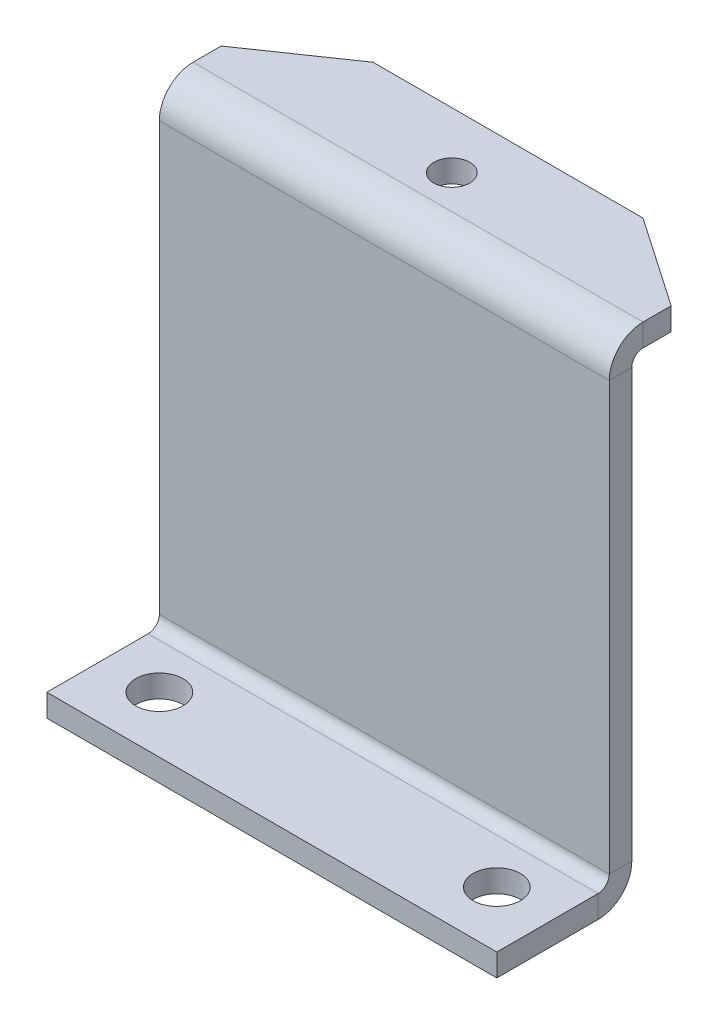
ISO-10303-21;
HEADER;
FILE_DESCRIPTION(('STEP AP214'),'2;1');
FILE_NAME('part.step','',(''),(''),'','','');
FILE_SCHEMA(('AUTOMOTIVE_DESIGN { 1 0 10303 214 1 1 1 1 }'));
ENDSEC;
DATA;
#1=APPLICATION_CONTEXT('core data for automotive mechanical design processes');
#2=APPLICATION_PROTOCOL_DEFINITION('international standard','automotive_design',2000,#1);
#3=PRODUCT_CONTEXT('',#1,'mechanical');
#4=PRODUCT('Part','Part','',(#3));
#5=PRODUCT_RELATED_PRODUCT_CATEGORY('part','',(#4));
#6=PRODUCT_DEFINITION_FORMATION('','',#4);
#7=PRODUCT_DEFINITION_CONTEXT('part definition',#1,'design');
#8=PRODUCT_DEFINITION('design','',#6,#7);
#9=PRODUCT_DEFINITION_SHAPE('','',#8);
#10=(LENGTH_UNIT() NAMED_UNIT(*) SI_UNIT(.MILLI.,.METRE.));
#11=(NAMED_UNIT(*) PLANE_ANGLE_UNIT() SI_UNIT($,.RADIAN.));
#12=(NAMED_UNIT(*) SI_UNIT($,.STERADIAN.) SOLID_ANGLE_UNIT());
#13=UNCERTAINTY_MEASURE_WITH_UNIT(LENGTH_MEASURE(1.E-05),#10,'distance_accuracy_value','');
#14=(GEOMETRIC_REPRESENTATION_CONTEXT(3) GLOBAL_UNCERTAINTY_ASSIGNED_CONTEXT((#13)) GLOBAL_UNIT_ASSIGNED_CONTEXT((#10,
#11,#12)) REPRESENTATION_CONTEXT('',''));
#15=CARTESIAN_POINT('',(0.,0.,0.));
#16=DIRECTION('',(0.,0.,1.));
#17=DIRECTION('',(1.,0.,0.));
#18=AXIS2_PLACEMENT_3D('',#15,#16,#17);
#19=CARTESIAN_POINT('',(20.,0.,-5.));
#20=DIRECTION('',(-1.,0.,0.));
#21=DIRECTION('',(0.,-1.,0.));
#22=AXIS2_PLACEMENT_3D('',#19,#20,#21);
#23=PLANE('',#22);
#24=DIRECTION('',(0.,0.,1.));
#25=VECTOR('',#24,1.);
#26=CARTESIAN_POINT('',(20.,3.,-5.));
#27=LINE('',#26,#25);
#28=CARTESIAN_POINT('',(20.,3.,-7.));
#29=VERTEX_POINT('',#28);
#30=CARTESIAN_POINT('',(20.,3.,-5.));
#31=VERTEX_POINT('',#30);
#32=EDGE_CURVE('E11',#29,#31,#27,.T.);
#33=ORIENTED_EDGE('',*,*,#32,.F.);
#34=DIRECTION('',(0.,1.,0.));
#35=VECTOR('',#34,1.);
#36=CARTESIAN_POINT('',(20.,0.,-7.));
#37=LINE('',#36,#35);
#38=CARTESIAN_POINT('',(20.,41.,-7.));
#39=VERTEX_POINT('',#38);
#40=EDGE_CURVE('E104',#39,#29,#37,.F.);
#41=ORIENTED_EDGE('',*,*,#40,.F.);
#42=DIRECTION('',(0.,0.,1.));
#43=VECTOR('',#42,1.);
#44=CARTESIAN_POINT('',(20.,41.,-5.));
#45=LINE('',#44,#43);
#46=CARTESIAN_POINT('',(20.,41.,-5.));
#47=VERTEX_POINT('',#46);
#48=EDGE_CURVE('E51',#39,#47,#45,.T.);
#49=ORIENTED_EDGE('',*,*,#48,.T.);
#50=DIRECTION('',(0.,-1.,0.));
#51=VECTOR('',#50,1.);
#52=CARTESIAN_POINT('',(20.,0.,-5.));
#53=LINE('',#52,#51);
#54=EDGE_CURVE('E106',#47,#31,#53,.T.);
#55=ORIENTED_EDGE('',*,*,#54,.T.);
#56=EDGE_LOOP('',(#33,#41,#49,#55));
#57=FACE_BOUND('',#56,.T.);
#58=ADVANCED_FACE('F41',(#57),#23,.F.);
#59=CARTESIAN_POINT('',(20.,41.,-8.));
#60=DIRECTION('',(-1.,0.,0.));
#61=DIRECTION('',(0.,0.,1.));
#62=AXIS2_PLACEMENT_3D('',#59,#60,#61);
#63=PLANE('',#62);
#64=ORIENTED_EDGE('',*,*,#48,.F.);
#65=CARTESIAN_POINT('',(20.,41.,-8.));
#66=DIRECTION('',(-1.,0.,0.));
#67=DIRECTION('',(0.,0.,1.));
#68=AXIS2_PLACEMENT_3D('',#65,#66,#67);
#69=CIRCLE('',#68,1.);
#70=CARTESIAN_POINT('',(20.,42.,-8.));
#71=VERTEX_POINT('',#70);
#72=EDGE_CURVE('E196',#39,#71,#69,.T.);
#73=ORIENTED_EDGE('',*,*,#72,.T.);
#74=DIRECTION('',(0.,1.,0.));
#75=VECTOR('',#74,1.);
#76=CARTESIAN_POINT('',(20.,44.,-8.));
#77=LINE('',#76,#75);
#78=CARTESIAN_POINT('',(20.,44.,-8.));
#79=VERTEX_POINT('',#78);
#80=EDGE_CURVE('E186',#71,#79,#77,.T.);
#81=ORIENTED_EDGE('',*,*,#80,.T.);
#82=CARTESIAN_POINT('',(20.,41.,-8.));
#83=DIRECTION('',(1.,0.,0.));
#84=DIRECTION('',(0.,0.,-1.));
#85=AXIS2_PLACEMENT_3D('',#82,#83,#84);
#86=CIRCLE('',#85,3.);
#87=EDGE_CURVE('E194',#47,#79,#86,.F.);
#88=ORIENTED_EDGE('',*,*,#87,.F.);
#89=EDGE_LOOP('',(#64,#73,#81,#88));
#90=FACE_BOUND('',#89,.T.);
#91=ADVANCED_FACE('F193',(#90),#63,.F.);
#92=CARTESIAN_POINT('',(20.,44.,-7.));
#93=DIRECTION('',(1.,0.,0.));
#94=DIRECTION('',(0.,0.,1.));
#95=AXIS2_PLACEMENT_3D('',#92,#93,#94);
#96=PLANE('',#95);
#97=ORIENTED_EDGE('',*,*,#80,.F.);
#98=DIRECTION('',(0.,0.,-1.));
#99=VECTOR('',#98,1.);
#100=CARTESIAN_POINT('',(20.,42.,-7.));
#101=LINE('',#100,#99);
#102=CARTESIAN_POINT('',(20.,42.,-10.5));
#103=VERTEX_POINT('',#102);
#104=EDGE_CURVE('E258',#103,#71,#101,.F.);
#105=ORIENTED_EDGE('',*,*,#104,.F.);
#106=DIRECTION('',(0.,1.,0.));
#107=VECTOR('',#106,1.);
#108=CARTESIAN_POINT('',(20.,44.,-10.5));
#109=LINE('',#108,#107);
#110=CARTESIAN_POINT('',(20.,44.,-10.5));
#111=VERTEX_POINT('',#110);
#112=EDGE_CURVE('E183',#103,#111,#109,.T.);
#113=ORIENTED_EDGE('',*,*,#112,.T.);
#114=DIRECTION('',(0.,0.,1.));
#115=VECTOR('',#114,1.);
#116=CARTESIAN_POINT('',(20.,44.,-7.));
#117=LINE('',#116,#115);
#118=EDGE_CURVE('E213',#111,#79,#117,.T.);
#119=ORIENTED_EDGE('',*,*,#118,.T.);
#120=EDGE_LOOP('',(#97,#105,#113,#119));
#121=FACE_BOUND('',#120,.T.);
#122=ADVANCED_FACE('F214',(#121),#96,.T.);
#123=CARTESIAN_POINT('',(20.,44.,-10.5));
#124=DIRECTION('',(0.566528822887065,0.,-0.824041924199368));
#125=DIRECTION('',(0.824041924199368,0.,0.566528822887065));
#126=AXIS2_PLACEMENT_3D('',#123,#124,#125);
#127=PLANE('',#126);
#128=ORIENTED_EDGE('',*,*,#112,.F.);
#129=DIRECTION('',(0.824041924199368,0.,0.566528822887065));
#130=VECTOR('',#129,1.);
#131=CARTESIAN_POINT('',(20.,42.,-10.5));
#132=LINE('',#131,#130);
#133=CARTESIAN_POINT('',(12.,42.,-16.));
#134=VERTEX_POINT('',#133);
#135=EDGE_CURVE('E156',#134,#103,#132,.T.);
#136=ORIENTED_EDGE('',*,*,#135,.F.);
#137=DIRECTION('',(0.,1.,0.));
#138=VECTOR('',#137,1.);
#139=CARTESIAN_POINT('',(12.,44.,-16.));
#140=LINE('',#139,#138);
#141=CARTESIAN_POINT('',(12.,44.,-16.));
#142=VERTEX_POINT('',#141);
#143=EDGE_CURVE('E180',#134,#142,#140,.T.);
#144=ORIENTED_EDGE('',*,*,#143,.T.);
#145=DIRECTION('',(0.824041924199368,0.,0.566528822887065));
#146=VECTOR('',#145,1.);
#147=CARTESIAN_POINT('',(20.,44.,-10.5));
#148=LINE('',#147,#146);
#149=EDGE_CURVE('E219',#142,#111,#148,.T.);
#150=ORIENTED_EDGE('',*,*,#149,.T.);
#151=EDGE_LOOP('',(#128,#136,#144,#150));
#152=FACE_BOUND('',#151,.T.);
#153=ADVANCED_FACE('F273',(#152),#127,.T.);
#154=CARTESIAN_POINT('',(-20.,44.,-16.));
#155=DIRECTION('',(0.,0.,1.));
#156=DIRECTION('',(-1.,0.,0.));
#157=AXIS2_PLACEMENT_3D('',#154,#155,#156);
#158=PLANE('',#157);
#159=ORIENTED_EDGE('',*,*,#143,.F.);
#160=DIRECTION('',(1.,0.,0.));
#161=VECTOR('',#160,1.);
#162=CARTESIAN_POINT('',(20.,42.,-16.));
#163=LINE('',#162,#161);
#164=CARTESIAN_POINT('',(-12.,42.,-16.));
#165=VERTEX_POINT('',#164);
#166=EDGE_CURVE('E141',#134,#165,#163,.F.);
#167=ORIENTED_EDGE('',*,*,#166,.T.);
#168=DIRECTION('',(0.,1.,0.));
#169=VECTOR('',#168,1.);
#170=CARTESIAN_POINT('',(-12.,44.,-16.));
#171=LINE('',#170,#169);
#172=CARTESIAN_POINT('',(-12.,44.,-16.));
#173=VERTEX_POINT('',#172);
#174=EDGE_CURVE('E177',#165,#173,#171,.T.);
#175=ORIENTED_EDGE('',*,*,#174,.T.);
#176=DIRECTION('',(-1.,0.,0.));
#177=VECTOR('',#176,1.);
#178=CARTESIAN_POINT('',(-20.,44.,-16.));
#179=LINE('',#178,#177);
#180=EDGE_CURVE('E312',#142,#173,#179,.T.);
#181=ORIENTED_EDGE('',*,*,#180,.F.);
#182=EDGE_LOOP('',(#159,#167,#175,#181));
#183=FACE_BOUND('',#182,.T.);
#184=ADVANCED_FACE('F583',(#183),#158,.F.);
#185=CARTESIAN_POINT('',(-20.,44.,-10.5));
#186=DIRECTION('',(-0.566528822887065,0.,-0.824041924199368));
#187=DIRECTION('',(0.824041924199368,0.,-0.566528822887065));
#188=AXIS2_PLACEMENT_3D('',#185,#186,#187);
#189=PLANE('',#188);
#190=ORIENTED_EDGE('',*,*,#174,.F.);
#191=DIRECTION('',(0.824041924199368,0.,-0.566528822887065));
#192=VECTOR('',#191,1.);
#193=CARTESIAN_POINT('',(-20.,42.,-10.5));
#194=LINE('',#193,#192);
#195=CARTESIAN_POINT('',(-20.,42.,-10.5));
#196=VERTEX_POINT('',#195);
#197=EDGE_CURVE('E144',#196,#165,#194,.T.);
#198=ORIENTED_EDGE('',*,*,#197,.F.);
#199=DIRECTION('',(0.,1.,0.));
#200=VECTOR('',#199,1.);
#201=CARTESIAN_POINT('',(-20.,44.,-10.5));
#202=LINE('',#201,#200);
#203=CARTESIAN_POINT('',(-20.,44.,-10.5));
#204=VERTEX_POINT('',#203);
#205=EDGE_CURVE('E174',#196,#204,#202,.T.);
#206=ORIENTED_EDGE('',*,*,#205,.T.);
#207=DIRECTION('',(0.824041924199368,0.,-0.566528822887065));
#208=VECTOR('',#207,1.);
#209=CARTESIAN_POINT('',(-20.,44.,-10.5));
#210=LINE('',#209,#208);
#211=EDGE_CURVE('E313',#204,#173,#210,.T.);
#212=ORIENTED_EDGE('',*,*,#211,.T.);
#213=EDGE_LOOP('',(#190,#198,#206,#212));
#214=FACE_BOUND('',#213,.T.);
#215=ADVANCED_FACE('F318',(#214),#189,.T.);
#216=CARTESIAN_POINT('',(-20.,44.,-7.));
#217=DIRECTION('',(1.,0.,0.));
#218=DIRECTION('',(0.,0.,1.));
#219=AXIS2_PLACEMENT_3D('',#216,#217,#218);
#220=PLANE('',#219);
#221=ORIENTED_EDGE('',*,*,#205,.F.);
#222=DIRECTION('',(0.,0.,-1.));
#223=VECTOR('',#222,1.);
#224=CARTESIAN_POINT('',(-20.,42.,-7.));
#225=LINE('',#224,#223);
#226=CARTESIAN_POINT('',(-20.,42.,-8.));
#227=VERTEX_POINT('',#226);
#228=EDGE_CURVE('E255',#196,#227,#225,.F.);
#229=ORIENTED_EDGE('',*,*,#228,.T.);
#230=DIRECTION('',(0.,1.,0.));
#231=VECTOR('',#230,1.);
#232=CARTESIAN_POINT('',(-20.,44.,-8.));
#233=LINE('',#232,#231);
#234=CARTESIAN_POINT('',(-20.,44.,-8.));
#235=VERTEX_POINT('',#234);
#236=EDGE_CURVE('E171',#227,#235,#233,.T.);
#237=ORIENTED_EDGE('',*,*,#236,.T.);
#238=DIRECTION('',(0.,0.,1.));
#239=VECTOR('',#238,1.);
#240=CARTESIAN_POINT('',(-20.,44.,-7.));
#241=LINE('',#240,#239);
#242=EDGE_CURVE('E220',#204,#235,#241,.T.);
#243=ORIENTED_EDGE('',*,*,#242,.F.);
#244=EDGE_LOOP('',(#221,#229,#237,#243));
#245=FACE_BOUND('',#244,.T.);
#246=ADVANCED_FACE('F323',(#245),#220,.F.);
#247=CARTESIAN_POINT('',(-20.,41.,-8.));
#248=DIRECTION('',(-1.,0.,0.));
#249=DIRECTION('',(0.,0.,1.));
#250=AXIS2_PLACEMENT_3D('',#247,#248,#249);
#251=PLANE('',#250);
#252=ORIENTED_EDGE('',*,*,#236,.F.);
#253=CARTESIAN_POINT('',(-20.,41.,-8.));
#254=DIRECTION('',(-1.,0.,0.));
#255=DIRECTION('',(0.,0.,1.));
#256=AXIS2_PLACEMENT_3D('',#253,#254,#255);
#257=CIRCLE('',#256,1.);
#258=CARTESIAN_POINT('',(-20.,41.,-7.));
#259=VERTEX_POINT('',#258);
#260=EDGE_CURVE('E146',#227,#259,#257,.F.);
#261=ORIENTED_EDGE('',*,*,#260,.T.);
#262=DIRECTION('',(0.,0.,1.));
#263=VECTOR('',#262,1.);
#264=CARTESIAN_POINT('',(-20.,41.,-5.));
#265=LINE('',#264,#263);
#266=CARTESIAN_POINT('',(-20.,41.,-5.));
#267=VERTEX_POINT('',#266);
#268=EDGE_CURVE('E169',#259,#267,#265,.T.);
#269=ORIENTED_EDGE('',*,*,#268,.T.);
#270=CARTESIAN_POINT('',(-20.,41.,-8.));
#271=DIRECTION('',(1.,0.,0.));
#272=DIRECTION('',(0.,0.,-1.));
#273=AXIS2_PLACEMENT_3D('',#270,#271,#272);
#274=CIRCLE('',#273,3.);
#275=EDGE_CURVE('E210',#235,#267,#274,.T.);
#276=ORIENTED_EDGE('',*,*,#275,.F.);
#277=EDGE_LOOP('',(#252,#261,#269,#276));
#278=FACE_BOUND('',#277,.T.);
#279=ADVANCED_FACE('F327',(#278),#251,.T.);
#280=CARTESIAN_POINT('',(-20.,0.,-5.));
#281=DIRECTION('',(1.,0.,0.));
#282=DIRECTION('',(0.,1.,0.));
#283=AXIS2_PLACEMENT_3D('',#280,#281,#282);
#284=PLANE('',#283);
#285=ORIENTED_EDGE('',*,*,#268,.F.);
#286=DIRECTION('',(0.,1.,0.));
#287=VECTOR('',#286,1.);
#288=CARTESIAN_POINT('',(-20.,0.,-7.));
#289=LINE('',#288,#287);
#290=CARTESIAN_POINT('',(-20.,3.,-7.));
#291=VERTEX_POINT('',#290);
#292=EDGE_CURVE('E134',#291,#259,#289,.T.);
#293=ORIENTED_EDGE('',*,*,#292,.F.);
#294=DIRECTION('',(0.,0.,1.));
#295=VECTOR('',#294,1.);
#296=CARTESIAN_POINT('',(-20.,3.,-5.));
#297=LINE('',#296,#295);
#298=CARTESIAN_POINT('',(-20.,3.,-5.));
#299=VERTEX_POINT('',#298);
#300=EDGE_CURVE('E166',#291,#299,#297,.T.);
#301=ORIENTED_EDGE('',*,*,#300,.T.);
#302=DIRECTION('',(0.,1.,0.));
#303=VECTOR('',#302,1.);
#304=CARTESIAN_POINT('',(-20.,0.,-5.));
#305=LINE('',#304,#303);
#306=EDGE_CURVE('E286',#299,#267,#305,.T.);
#307=ORIENTED_EDGE('',*,*,#306,.T.);
#308=EDGE_LOOP('',(#285,#293,#301,#307));
#309=FACE_BOUND('',#308,.T.);
#310=ADVANCED_FACE('F330',(#309),#284,.F.);
#311=CARTESIAN_POINT('',(-20.,3.,-4.));
#312=DIRECTION('',(1.,0.,0.));
#313=DIRECTION('',(0.,0.,-1.));
#314=AXIS2_PLACEMENT_3D('',#311,#312,#313);
#315=PLANE('',#314);
#316=ORIENTED_EDGE('',*,*,#300,.F.);
#317=CARTESIAN_POINT('',(-20.,3.,-4.));
#318=DIRECTION('',(1.,0.,0.));
#319=DIRECTION('',(0.,0.,-1.));
#320=AXIS2_PLACEMENT_3D('',#317,#318,#319);
#321=CIRCLE('',#320,3.);
#322=CARTESIAN_POINT('',(-20.,0.,-4.));
#323=VERTEX_POINT('',#322);
#324=EDGE_CURVE('E122',#291,#323,#321,.F.);
#325=ORIENTED_EDGE('',*,*,#324,.T.);
#326=DIRECTION('',(0.,1.,0.));
#327=VECTOR('',#326,1.);
#328=CARTESIAN_POINT('',(-20.,2.,-4.));
#329=LINE('',#328,#327);
#330=CARTESIAN_POINT('',(-20.,2.,-4.));
#331=VERTEX_POINT('',#330);
#332=EDGE_CURVE('E163',#323,#331,#329,.T.);
#333=ORIENTED_EDGE('',*,*,#332,.T.);
#334=CARTESIAN_POINT('',(-20.,3.,-4.));
#335=DIRECTION('',(-1.,0.,0.));
#336=DIRECTION('',(0.,0.,1.));
#337=AXIS2_PLACEMENT_3D('',#334,#335,#336);
#338=CIRCLE('',#337,1.);
#339=EDGE_CURVE('E238',#299,#331,#338,.T.);
#340=ORIENTED_EDGE('',*,*,#339,.F.);
#341=EDGE_LOOP('',(#316,#325,#333,#340));
#342=FACE_BOUND('',#341,.T.);
#343=ADVANCED_FACE('F362',(#342),#315,.F.);
#344=CARTESIAN_POINT('',(-20.,2.,-5.));
#345=DIRECTION('',(-1.,0.,0.));
#346=DIRECTION('',(0.,0.,1.));
#347=AXIS2_PLACEMENT_3D('',#344,#345,#346);
#348=PLANE('',#347);
#349=ORIENTED_EDGE('',*,*,#332,.F.);
#350=DIRECTION('',(0.,0.,1.));
#351=VECTOR('',#350,1.);
#352=CARTESIAN_POINT('',(-20.,0.,0.));
#353=LINE('',#352,#351);
#354=CARTESIAN_POINT('',(-20.,0.,5.));
#355=VERTEX_POINT('',#354);
#356=EDGE_CURVE('E247',#323,#355,#353,.T.);
#357=ORIENTED_EDGE('',*,*,#356,.T.);
#358=DIRECTION('',(0.,1.,0.));
#359=VECTOR('',#358,1.);
#360=CARTESIAN_POINT('',(-20.,2.,5.));
#361=LINE('',#360,#359);
#362=CARTESIAN_POINT('',(-20.,2.,5.));
#363=VERTEX_POINT('',#362);
#364=EDGE_CURVE('E160',#355,#363,#361,.T.);
#365=ORIENTED_EDGE('',*,*,#364,.T.);
#366=DIRECTION('',(0.,0.,1.));
#367=VECTOR('',#366,1.);
#368=CARTESIAN_POINT('',(-20.,2.,-5.));
#369=LINE('',#368,#367);
#370=EDGE_CURVE('E295',#331,#363,#369,.T.);
#371=ORIENTED_EDGE('',*,*,#370,.F.);
#372=EDGE_LOOP('',(#349,#357,#365,#371));
#373=FACE_BOUND('',#372,.T.);
#374=ADVANCED_FACE('F345',(#373),#348,.T.);
#375=CARTESIAN_POINT('',(-20.,2.,5.));
#376=DIRECTION('',(0.,0.,1.));
#377=DIRECTION('',(1.,0.,0.));
#378=AXIS2_PLACEMENT_3D('',#375,#376,#377);
#379=PLANE('',#378);
#380=ORIENTED_EDGE('',*,*,#364,.F.);
#381=DIRECTION('',(1.,0.,0.));
#382=VECTOR('',#381,1.);
#383=CARTESIAN_POINT('',(0.,0.,5.));
#384=LINE('',#383,#382);
#385=CARTESIAN_POINT('',(20.,0.,5.));
#386=VERTEX_POINT('',#385);
#387=EDGE_CURVE('E153',#355,#386,#384,.T.);
#388=ORIENTED_EDGE('',*,*,#387,.T.);
#389=DIRECTION('',(0.,1.,0.));
#390=VECTOR('',#389,1.);
#391=CARTESIAN_POINT('',(20.,2.,5.));
#392=LINE('',#391,#390);
#393=CARTESIAN_POINT('',(20.,2.,5.));
#394=VERTEX_POINT('',#393);
#395=EDGE_CURVE('E157',#386,#394,#392,.T.);
#396=ORIENTED_EDGE('',*,*,#395,.T.);
#397=DIRECTION('',(1.,0.,0.));
#398=VECTOR('',#397,1.);
#399=CARTESIAN_POINT('',(-20.,2.,5.));
#400=LINE('',#399,#398);
#401=EDGE_CURVE('E298',#363,#394,#400,.T.);
#402=ORIENTED_EDGE('',*,*,#401,.F.);
#403=EDGE_LOOP('',(#380,#388,#396,#402));
#404=FACE_BOUND('',#403,.T.);
#405=ADVANCED_FACE('F353',(#404),#379,.T.);
#406=CARTESIAN_POINT('',(20.,2.,-5.));
#407=DIRECTION('',(1.,0.,0.));
#408=DIRECTION('',(0.,0.,-1.));
#409=AXIS2_PLACEMENT_3D('',#406,#407,#408);
#410=PLANE('',#409);
#411=ORIENTED_EDGE('',*,*,#395,.F.);
#412=DIRECTION('',(0.,0.,1.));
#413=VECTOR('',#412,1.);
#414=CARTESIAN_POINT('',(20.,0.,0.));
#415=LINE('',#414,#413);
#416=CARTESIAN_POINT('',(20.,0.,-4.));
#417=VERTEX_POINT('',#416);
#418=EDGE_CURVE('E245',#386,#417,#415,.F.);
#419=ORIENTED_EDGE('',*,*,#418,.T.);
#420=DIRECTION('',(0.,1.,0.));
#421=VECTOR('',#420,1.);
#422=CARTESIAN_POINT('',(20.,2.,-4.));
#423=LINE('',#422,#421);
#424=CARTESIAN_POINT('',(20.,2.,-4.));
#425=VERTEX_POINT('',#424);
#426=EDGE_CURVE('E45',#417,#425,#423,.T.);
#427=ORIENTED_EDGE('',*,*,#426,.T.);
#428=DIRECTION('',(0.,0.,-1.));
#429=VECTOR('',#428,1.);
#430=CARTESIAN_POINT('',(20.,2.,-5.));
#431=LINE('',#430,#429);
#432=EDGE_CURVE('E292',#394,#425,#431,.T.);
#433=ORIENTED_EDGE('',*,*,#432,.F.);
#434=EDGE_LOOP('',(#411,#419,#427,#433));
#435=FACE_BOUND('',#434,.T.);
#436=ADVANCED_FACE('F357',(#435),#410,.T.);
#437=CARTESIAN_POINT('',(0.,44.,-11.));
#438=DIRECTION('',(0.,-1.,0.));
#439=DIRECTION('',(0.,0.,-1.));
#440=AXIS2_PLACEMENT_3D('',#437,#438,#439);
#441=CYLINDRICAL_SURFACE('',#440,1.6);
#442=CARTESIAN_POINT('',(0.,44.,-11.));
#443=DIRECTION('',(0.,1.,0.));
#444=DIRECTION('',(0.,0.,1.));
#445=AXIS2_PLACEMENT_3D('',#442,#443,#444);
#446=CIRCLE('',#445,1.6);
#447=CARTESIAN_POINT('',(0.,44.,-9.4));
#448=VERTEX_POINT('',#447);
#449=EDGE_CURVE('E279',#448,#448,#446,.T.);
#450=ORIENTED_EDGE('',*,*,#449,.T.);
#451=EDGE_LOOP('',(#450));
#452=FACE_BOUND('',#451,.T.);
#453=CARTESIAN_POINT('',(0.,42.,-11.));
#454=DIRECTION('',(0.,1.,0.));
#455=DIRECTION('',(0.,0.,1.));
#456=AXIS2_PLACEMENT_3D('',#453,#454,#455);
#457=CIRCLE('',#456,1.6);
#458=CARTESIAN_POINT('',(0.,42.,-9.4));
#459=VERTEX_POINT('',#458);
#460=EDGE_CURVE('E135',#459,#459,#457,.T.);
#461=ORIENTED_EDGE('',*,*,#460,.F.);
#462=EDGE_LOOP('',(#461));
#463=FACE_BOUND('',#462,.T.);
#464=ADVANCED_FACE('F43',(#452,#463),#441,.F.);
#465=CARTESIAN_POINT('',(-15.,2.,0.));
#466=DIRECTION('',(0.,1.,0.));
#467=DIRECTION('',(0.,0.,1.));
#468=AXIS2_PLACEMENT_3D('',#465,#466,#467);
#469=CYLINDRICAL_SURFACE('',#468,2.1);
#470=CARTESIAN_POINT('',(-15.,2.,0.));
#471=DIRECTION('',(0.,1.,0.));
#472=DIRECTION('',(0.,0.,1.));
#473=AXIS2_PLACEMENT_3D('',#470,#471,#472);
#474=CIRCLE('',#473,2.1);
#475=CARTESIAN_POINT('',(-15.,2.,2.1));
#476=VERTEX_POINT('',#475);
#477=EDGE_CURVE('E289',#476,#476,#474,.T.);
#478=ORIENTED_EDGE('',*,*,#477,.T.);
#479=EDGE_LOOP('',(#478));
#480=FACE_BOUND('',#479,.T.);
#481=CARTESIAN_POINT('',(-15.,0.,0.));
#482=DIRECTION('',(0.,1.,0.));
#483=DIRECTION('',(0.,0.,1.));
#484=AXIS2_PLACEMENT_3D('',#481,#482,#483);
#485=CIRCLE('',#484,2.1);
#486=CARTESIAN_POINT('',(-15.,0.,2.1));
#487=VERTEX_POINT('',#486);
#488=EDGE_CURVE('E242',#487,#487,#485,.T.);
#489=ORIENTED_EDGE('',*,*,#488,.F.);
#490=EDGE_LOOP('',(#489));
#491=FACE_BOUND('',#490,.T.);
#492=ADVANCED_FACE('F382',(#480,#491),#469,.F.);
#493=CARTESIAN_POINT('',(20.,3.,-4.));
#494=DIRECTION('',(-1.,0.,0.));
#495=DIRECTION('',(0.,0.,1.));
#496=AXIS2_PLACEMENT_3D('',#493,#494,#495);
#497=PLANE('',#496);
#498=CARTESIAN_POINT('',(20.,3.,-4.));
#499=DIRECTION('',(1.,0.,0.));
#500=DIRECTION('',(0.,0.,-1.));
#501=AXIS2_PLACEMENT_3D('',#498,#499,#500);
#502=CIRCLE('',#501,3.);
#503=EDGE_CURVE('E119',#417,#29,#502,.T.);
#504=ORIENTED_EDGE('',*,*,#503,.T.);
#505=ORIENTED_EDGE('',*,*,#32,.T.);
#506=CARTESIAN_POINT('',(20.,3.,-4.));
#507=DIRECTION('',(1.,0.,0.));
#508=DIRECTION('',(0.,0.,-1.));
#509=AXIS2_PLACEMENT_3D('',#506,#507,#508);
#510=CIRCLE('',#509,1.);
#511=EDGE_CURVE('E234',#425,#31,#510,.T.);
#512=ORIENTED_EDGE('',*,*,#511,.F.);
#513=ORIENTED_EDGE('',*,*,#426,.F.);
#514=EDGE_LOOP('',(#504,#505,#512,#513));
#515=FACE_BOUND('',#514,.T.);
#516=ADVANCED_FACE('F138',(#515),#497,.F.);
#517=CARTESIAN_POINT('',(15.,2.,0.));
#518=DIRECTION('',(0.,1.,0.));
#519=DIRECTION('',(0.,0.,1.));
#520=AXIS2_PLACEMENT_3D('',#517,#518,#519);
#521=CYLINDRICAL_SURFACE('',#520,2.1);
#522=CARTESIAN_POINT('',(15.,2.,0.));
#523=DIRECTION('',(0.,1.,0.));
#524=DIRECTION('',(0.,0.,-1.));
#525=AXIS2_PLACEMENT_3D('',#522,#523,#524);
#526=CIRCLE('',#525,2.1);
#527=CARTESIAN_POINT('',(15.,2.,-2.1));
#528=VERTEX_POINT('',#527);
#529=EDGE_CURVE('E301',#528,#528,#526,.T.);
#530=ORIENTED_EDGE('',*,*,#529,.T.);
#531=EDGE_LOOP('',(#530));
#532=FACE_BOUND('',#531,.T.);
#533=CARTESIAN_POINT('',(15.,0.,0.));
#534=DIRECTION('',(0.,1.,0.));
#535=DIRECTION('',(0.,0.,1.));
#536=AXIS2_PLACEMENT_3D('',#533,#534,#535);
#537=CIRCLE('',#536,2.1);
#538=CARTESIAN_POINT('',(15.,0.,2.1));
#539=VERTEX_POINT('',#538);
#540=EDGE_CURVE('E150',#539,#539,#537,.T.);
#541=ORIENTED_EDGE('',*,*,#540,.F.);
#542=EDGE_LOOP('',(#541));
#543=FACE_BOUND('',#542,.T.);
#544=ADVANCED_FACE('F381',(#532,#543),#521,.F.);
#545=CARTESIAN_POINT('',(0.,2.,0.));
#546=DIRECTION('',(0.,1.,0.));
#547=DIRECTION('',(0.,0.,1.));
#548=AXIS2_PLACEMENT_3D('',#545,#546,#547);
#549=PLANE('',#548);
#550=ORIENTED_EDGE('',*,*,#477,.F.);
#551=EDGE_LOOP('',(#550));
#552=FACE_BOUND('',#551,.T.);
#553=ORIENTED_EDGE('',*,*,#432,.T.);
#554=DIRECTION('',(-1.,0.,0.));
#555=VECTOR('',#554,1.);
#556=CARTESIAN_POINT('',(-20.,2.,-4.));
#557=LINE('',#556,#555);
#558=EDGE_CURVE('E231',#425,#331,#557,.T.);
#559=ORIENTED_EDGE('',*,*,#558,.T.);
#560=ORIENTED_EDGE('',*,*,#370,.T.);
#561=ORIENTED_EDGE('',*,*,#401,.T.);
#562=EDGE_LOOP('',(#553,#559,#560,#561));
#563=FACE_BOUND('',#562,.T.);
#564=ORIENTED_EDGE('',*,*,#529,.F.);
#565=EDGE_LOOP('',(#564));
#566=FACE_BOUND('',#565,.T.);
#567=ADVANCED_FACE('F351',(#552,#563,#566),#549,.T.);
#568=CARTESIAN_POINT('',(0.,0.,-5.));
#569=DIRECTION('',(0.,0.,1.));
#570=DIRECTION('',(1.,0.,0.));
#571=AXIS2_PLACEMENT_3D('',#568,#569,#570);
#572=PLANE('',#571);
#573=ORIENTED_EDGE('',*,*,#54,.F.);
#574=DIRECTION('',(1.,0.,0.));
#575=VECTOR('',#574,1.);
#576=CARTESIAN_POINT('',(-20.,41.,-5.));
#577=LINE('',#576,#575);
#578=EDGE_CURVE('E209',#47,#267,#577,.F.);
#579=ORIENTED_EDGE('',*,*,#578,.T.);
#580=ORIENTED_EDGE('',*,*,#306,.F.);
#581=DIRECTION('',(-1.,0.,0.));
#582=VECTOR('',#581,1.);
#583=CARTESIAN_POINT('',(20.,3.,-5.));
#584=LINE('',#583,#582);
#585=EDGE_CURVE('E228',#299,#31,#584,.F.);
#586=ORIENTED_EDGE('',*,*,#585,.T.);
#587=EDGE_LOOP('',(#573,#579,#580,#586));
#588=FACE_BOUND('',#587,.T.);
#589=ADVANCED_FACE('F332',(#588),#572,.T.);
#590=CARTESIAN_POINT('',(20.,44.,-7.));
#591=DIRECTION('',(0.,-1.,0.));
#592=DIRECTION('',(0.,0.,-1.));
#593=AXIS2_PLACEMENT_3D('',#590,#591,#592);
#594=PLANE('',#593);
#595=ORIENTED_EDGE('',*,*,#242,.T.);
#596=DIRECTION('',(1.,0.,0.));
#597=VECTOR('',#596,1.);
#598=CARTESIAN_POINT('',(20.,44.,-8.));
#599=LINE('',#598,#597);
#600=EDGE_CURVE('E207',#235,#79,#599,.T.);
#601=ORIENTED_EDGE('',*,*,#600,.T.);
#602=ORIENTED_EDGE('',*,*,#118,.F.);
#603=ORIENTED_EDGE('',*,*,#149,.F.);
#604=ORIENTED_EDGE('',*,*,#180,.T.);
#605=ORIENTED_EDGE('',*,*,#211,.F.);
#606=EDGE_LOOP('',(#595,#601,#602,#603,#604,#605));
#607=FACE_BOUND('',#606,.T.);
#608=ORIENTED_EDGE('',*,*,#449,.F.);
#609=EDGE_LOOP('',(#608));
#610=FACE_BOUND('',#609,.T.);
#611=ADVANCED_FACE('F223',(#607,#610),#594,.F.);
#612=CARTESIAN_POINT('',(0.,3.,-4.));
#613=DIRECTION('',(1.,0.,0.));
#614=DIRECTION('',(0.,0.,-1.));
#615=AXIS2_PLACEMENT_3D('',#612,#613,#614);
#616=CYLINDRICAL_SURFACE('',#615,1.);
#617=ORIENTED_EDGE('',*,*,#511,.T.);
#618=ORIENTED_EDGE('',*,*,#585,.F.);
#619=ORIENTED_EDGE('',*,*,#339,.T.);
#620=ORIENTED_EDGE('',*,*,#558,.F.);
#621=EDGE_LOOP('',(#617,#618,#619,#620));
#622=FACE_BOUND('',#621,.T.);
#623=ADVANCED_FACE('F334',(#622),#616,.F.);
#624=CARTESIAN_POINT('',(20.,41.,-8.));
#625=DIRECTION('',(-1.,0.,0.));
#626=DIRECTION('',(0.,0.,1.));
#627=AXIS2_PLACEMENT_3D('',#624,#625,#626);
#628=CYLINDRICAL_SURFACE('',#627,3.);
#629=ORIENTED_EDGE('',*,*,#275,.T.);
#630=ORIENTED_EDGE('',*,*,#578,.F.);
#631=ORIENTED_EDGE('',*,*,#87,.T.);
#632=ORIENTED_EDGE('',*,*,#600,.F.);
#633=EDGE_LOOP('',(#629,#630,#631,#632));
#634=FACE_BOUND('',#633,.T.);
#635=ADVANCED_FACE('F205',(#634),#628,.T.);
#636=CARTESIAN_POINT('',(0.,0.,0.));
#637=DIRECTION('',(0.,1.,0.));
#638=DIRECTION('',(0.,0.,1.));
#639=AXIS2_PLACEMENT_3D('',#636,#637,#638);
#640=PLANE('',#639);
#641=ORIENTED_EDGE('',*,*,#488,.T.);
#642=EDGE_LOOP('',(#641));
#643=FACE_BOUND('',#642,.T.);
#644=ORIENTED_EDGE('',*,*,#418,.F.);
#645=ORIENTED_EDGE('',*,*,#387,.F.);
#646=ORIENTED_EDGE('',*,*,#356,.F.);
#647=DIRECTION('',(1.,0.,0.));
#648=VECTOR('',#647,1.);
#649=CARTESIAN_POINT('',(0.,0.,-4.));
#650=LINE('',#649,#648);
#651=EDGE_CURVE('E127',#417,#323,#650,.F.);
#652=ORIENTED_EDGE('',*,*,#651,.F.);
#653=EDGE_LOOP('',(#644,#645,#646,#652));
#654=FACE_BOUND('',#653,.T.);
#655=ORIENTED_EDGE('',*,*,#540,.T.);
#656=EDGE_LOOP('',(#655));
#657=FACE_BOUND('',#656,.T.);
#658=ADVANCED_FACE('F359',(#643,#654,#657),#640,.F.);
#659=CARTESIAN_POINT('',(0.,0.,-7.));
#660=DIRECTION('',(0.,0.,1.));
#661=DIRECTION('',(1.,0.,0.));
#662=AXIS2_PLACEMENT_3D('',#659,#660,#661);
#663=PLANE('',#662);
#664=ORIENTED_EDGE('',*,*,#40,.T.);
#665=DIRECTION('',(1.,0.,0.));
#666=VECTOR('',#665,1.);
#667=CARTESIAN_POINT('',(0.,3.,-7.));
#668=LINE('',#667,#666);
#669=EDGE_CURVE('E116',#291,#29,#668,.T.);
#670=ORIENTED_EDGE('',*,*,#669,.F.);
#671=ORIENTED_EDGE('',*,*,#292,.T.);
#672=DIRECTION('',(1.,0.,0.));
#673=VECTOR('',#672,1.);
#674=CARTESIAN_POINT('',(0.,41.,-7.));
#675=LINE('',#674,#673);
#676=EDGE_CURVE('E132',#39,#259,#675,.F.);
#677=ORIENTED_EDGE('',*,*,#676,.F.);
#678=EDGE_LOOP('',(#664,#670,#671,#677));
#679=FACE_BOUND('',#678,.T.);
#680=ADVANCED_FACE('F130',(#679),#663,.F.);
#681=CARTESIAN_POINT('',(20.,42.,-7.));
#682=DIRECTION('',(0.,-1.,0.));
#683=DIRECTION('',(0.,0.,-1.));
#684=AXIS2_PLACEMENT_3D('',#681,#682,#683);
#685=PLANE('',#684);
#686=ORIENTED_EDGE('',*,*,#228,.F.);
#687=ORIENTED_EDGE('',*,*,#197,.T.);
#688=ORIENTED_EDGE('',*,*,#166,.F.);
#689=ORIENTED_EDGE('',*,*,#135,.T.);
#690=ORIENTED_EDGE('',*,*,#104,.T.);
#691=DIRECTION('',(1.,0.,0.));
#692=VECTOR('',#691,1.);
#693=CARTESIAN_POINT('',(20.,42.,-8.));
#694=LINE('',#693,#692);
#695=EDGE_CURVE('E126',#227,#71,#694,.T.);
#696=ORIENTED_EDGE('',*,*,#695,.F.);
#697=EDGE_LOOP('',(#686,#687,#688,#689,#690,#696));
#698=FACE_BOUND('',#697,.T.);
#699=ORIENTED_EDGE('',*,*,#460,.T.);
#700=EDGE_LOOP('',(#699));
#701=FACE_BOUND('',#700,.T.);
#702=ADVANCED_FACE('F267',(#698,#701),#685,.T.);
#703=CARTESIAN_POINT('',(0.,3.,-4.));
#704=DIRECTION('',(1.,0.,0.));
#705=DIRECTION('',(0.,0.,-1.));
#706=AXIS2_PLACEMENT_3D('',#703,#704,#705);
#707=CYLINDRICAL_SURFACE('',#706,3.);
#708=ORIENTED_EDGE('',*,*,#503,.F.);
#709=ORIENTED_EDGE('',*,*,#651,.T.);
#710=ORIENTED_EDGE('',*,*,#324,.F.);
#711=ORIENTED_EDGE('',*,*,#669,.T.);
#712=EDGE_LOOP('',(#708,#709,#710,#711));
#713=FACE_BOUND('',#712,.T.);
#714=ADVANCED_FACE('F117',(#713),#707,.T.);
#715=CARTESIAN_POINT('',(20.,41.,-8.));
#716=DIRECTION('',(-1.,0.,0.));
#717=DIRECTION('',(0.,0.,1.));
#718=AXIS2_PLACEMENT_3D('',#715,#716,#717);
#719=CYLINDRICAL_SURFACE('',#718,1.);
#720=ORIENTED_EDGE('',*,*,#260,.F.);
#721=ORIENTED_EDGE('',*,*,#695,.T.);
#722=ORIENTED_EDGE('',*,*,#72,.F.);
#723=ORIENTED_EDGE('',*,*,#676,.T.);
#724=EDGE_LOOP('',(#720,#721,#722,#723));
#725=FACE_BOUND('',#724,.T.);
#726=ADVANCED_FACE('F410',(#725),#719,.F.);
#727=CLOSED_SHELL('',(#58,#91,#122,#153,#184,#215,#246,#279,#310,#343,#374,#405,#436,#464,#492,
#516,#544,#567,#589,#611,#623,#635,#658,#680,#702,#714,#726));
#728=MANIFOLD_SOLID_BREP('B2',#727);
#729=ADVANCED_BREP_SHAPE_REPRESENTATION('',(#18,#728),#14);
#730=SHAPE_DEFINITION_REPRESENTATION(#9,#729);
ENDSEC;
END-ISO-10303-21;
